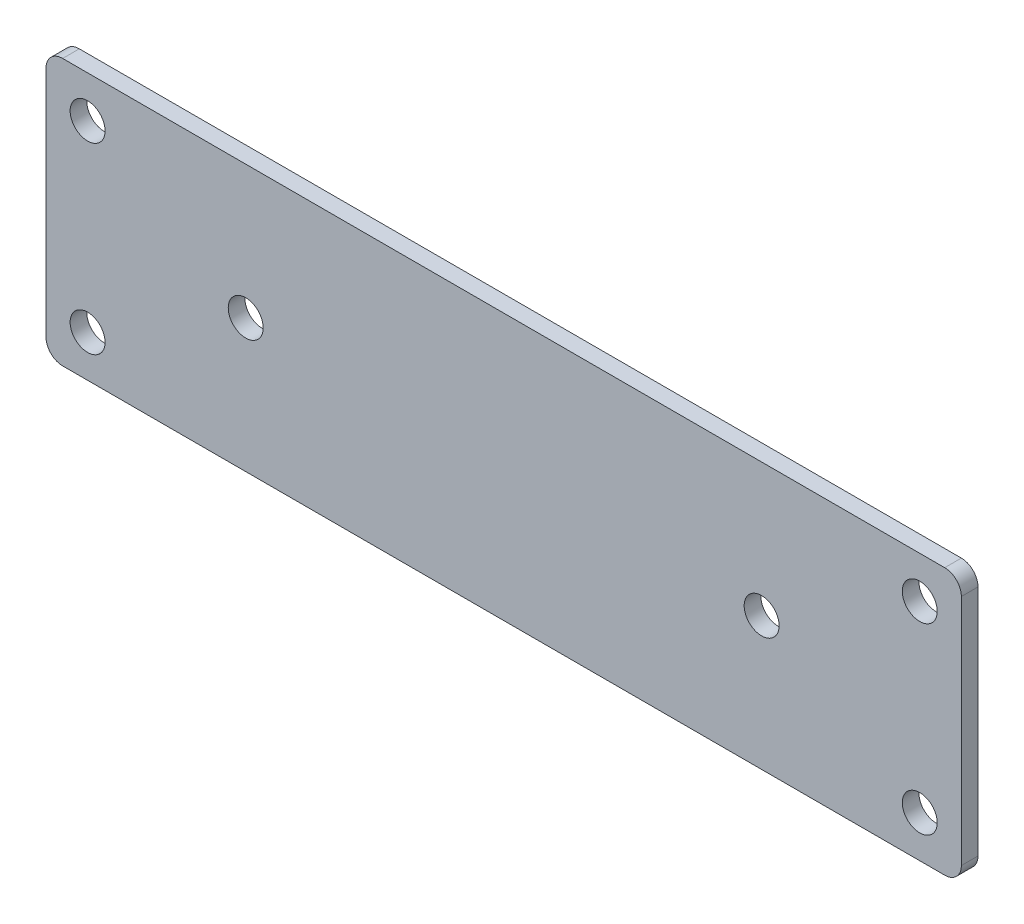
ISO-10303-21;
HEADER;
FILE_DESCRIPTION(('STEP AP214'),'2;1');
FILE_NAME('part.step','',(''),(''),'','','');
FILE_SCHEMA(('AUTOMOTIVE_DESIGN { 1 0 10303 214 1 1 1 1 }'));
ENDSEC;
DATA;
#1=APPLICATION_CONTEXT('core data for automotive mechanical design processes');
#2=APPLICATION_PROTOCOL_DEFINITION('international standard','automotive_design',2000,#1);
#3=PRODUCT_CONTEXT('',#1,'mechanical');
#4=PRODUCT('Part','Part','',(#3));
#5=PRODUCT_RELATED_PRODUCT_CATEGORY('part','',(#4));
#6=PRODUCT_DEFINITION_FORMATION('','',#4);
#7=PRODUCT_DEFINITION_CONTEXT('part definition',#1,'design');
#8=PRODUCT_DEFINITION('design','',#6,#7);
#9=PRODUCT_DEFINITION_SHAPE('','',#8);
#10=(LENGTH_UNIT() NAMED_UNIT(*) SI_UNIT(.MILLI.,.METRE.));
#11=(NAMED_UNIT(*) PLANE_ANGLE_UNIT() SI_UNIT($,.RADIAN.));
#12=(NAMED_UNIT(*) SI_UNIT($,.STERADIAN.) SOLID_ANGLE_UNIT());
#13=UNCERTAINTY_MEASURE_WITH_UNIT(LENGTH_MEASURE(1.E-05),#10,'distance_accuracy_value','');
#14=(GEOMETRIC_REPRESENTATION_CONTEXT(3) GLOBAL_UNCERTAINTY_ASSIGNED_CONTEXT((#13)) GLOBAL_UNIT_ASSIGNED_CONTEXT((#10,
#11,#12)) REPRESENTATION_CONTEXT('',''));
#15=CARTESIAN_POINT('',(0.,0.,0.));
#16=DIRECTION('',(0.,0.,1.));
#17=DIRECTION('',(1.,0.,0.));
#18=AXIS2_PLACEMENT_3D('',#15,#16,#17);
#19=CARTESIAN_POINT('',(0.,0.,2.));
#20=DIRECTION('',(0.,0.,1.));
#21=DIRECTION('',(1.,0.,0.));
#22=AXIS2_PLACEMENT_3D('',#19,#20,#21);
#23=PLANE('',#22);
#24=CARTESIAN_POINT('',(-50.,-11.,2.));
#25=DIRECTION('',(0.,0.,1.));
#26=DIRECTION('',(1.,0.,0.));
#27=AXIS2_PLACEMENT_3D('',#24,#25,#26);
#28=CIRCLE('',#27,2.10000000000002);
#29=CARTESIAN_POINT('',(-47.9,-11.,2.));
#30=VERTEX_POINT('',#29);
#31=EDGE_CURVE('E278',#30,#30,#28,.T.);
#32=ORIENTED_EDGE('',*,*,#31,.F.);
#33=EDGE_LOOP('',(#32));
#34=FACE_BOUND('',#33,.T.);
#35=CARTESIAN_POINT('',(50.,11.,2.));
#36=DIRECTION('',(0.,0.,1.));
#37=DIRECTION('',(1.,0.,0.));
#38=AXIS2_PLACEMENT_3D('',#35,#36,#37);
#39=CIRCLE('',#38,2.1);
#40=CARTESIAN_POINT('',(52.1,11.,2.));
#41=VERTEX_POINT('',#40);
#42=EDGE_CURVE('E170',#41,#41,#39,.T.);
#43=ORIENTED_EDGE('',*,*,#42,.F.);
#44=EDGE_LOOP('',(#43));
#45=FACE_BOUND('',#44,.T.);
#46=CARTESIAN_POINT('',(31.,0.,2.));
#47=DIRECTION('',(0.,0.,1.));
#48=DIRECTION('',(1.,0.,0.));
#49=AXIS2_PLACEMENT_3D('',#46,#47,#48);
#50=CIRCLE('',#49,2.1);
#51=CARTESIAN_POINT('',(33.1,0.,2.));
#52=VERTEX_POINT('',#51);
#53=EDGE_CURVE('E171',#52,#52,#50,.T.);
#54=ORIENTED_EDGE('',*,*,#53,.F.);
#55=EDGE_LOOP('',(#54));
#56=FACE_BOUND('',#55,.T.);
#57=DIRECTION('',(0.,-1.,0.));
#58=VECTOR('',#57,1.);
#59=CARTESIAN_POINT('',(-55.,16.,2.));
#60=LINE('',#59,#58);
#61=CARTESIAN_POINT('',(-55.,14.,2.));
#62=VERTEX_POINT('',#61);
#63=CARTESIAN_POINT('',(-55.,-14.,2.));
#64=VERTEX_POINT('',#63);
#65=EDGE_CURVE('E184',#62,#64,#60,.T.);
#66=ORIENTED_EDGE('',*,*,#65,.T.);
#67=CARTESIAN_POINT('',(-53.,-14.,2.));
#68=DIRECTION('',(0.,0.,1.));
#69=DIRECTION('',(1.,0.,0.));
#70=AXIS2_PLACEMENT_3D('',#67,#68,#69);
#71=CIRCLE('',#70,2.);
#72=CARTESIAN_POINT('',(-53.,-16.,2.));
#73=VERTEX_POINT('',#72);
#74=EDGE_CURVE('E195',#64,#73,#71,.T.);
#75=ORIENTED_EDGE('',*,*,#74,.T.);
#76=DIRECTION('',(1.,0.,0.));
#77=VECTOR('',#76,1.);
#78=CARTESIAN_POINT('',(-55.,-16.,2.));
#79=LINE('',#78,#77);
#80=CARTESIAN_POINT('',(53.,-16.,2.));
#81=VERTEX_POINT('',#80);
#82=EDGE_CURVE('E123',#73,#81,#79,.T.);
#83=ORIENTED_EDGE('',*,*,#82,.T.);
#84=CARTESIAN_POINT('',(53.,-14.,2.));
#85=DIRECTION('',(0.,0.,1.));
#86=DIRECTION('',(1.,0.,0.));
#87=AXIS2_PLACEMENT_3D('',#84,#85,#86);
#88=CIRCLE('',#87,2.);
#89=CARTESIAN_POINT('',(55.,-14.,2.));
#90=VERTEX_POINT('',#89);
#91=EDGE_CURVE('E193',#81,#90,#88,.T.);
#92=ORIENTED_EDGE('',*,*,#91,.T.);
#93=DIRECTION('',(0.,1.,0.));
#94=VECTOR('',#93,1.);
#95=CARTESIAN_POINT('',(55.,16.,2.));
#96=LINE('',#95,#94);
#97=CARTESIAN_POINT('',(55.,14.,2.));
#98=VERTEX_POINT('',#97);
#99=EDGE_CURVE('E130',#90,#98,#96,.T.);
#100=ORIENTED_EDGE('',*,*,#99,.T.);
#101=CARTESIAN_POINT('',(53.,14.,2.));
#102=DIRECTION('',(0.,0.,1.));
#103=DIRECTION('',(1.,0.,0.));
#104=AXIS2_PLACEMENT_3D('',#101,#102,#103);
#105=CIRCLE('',#104,2.);
#106=CARTESIAN_POINT('',(53.,16.,2.));
#107=VERTEX_POINT('',#106);
#108=EDGE_CURVE('E58',#98,#107,#105,.T.);
#109=ORIENTED_EDGE('',*,*,#108,.T.);
#110=DIRECTION('',(-1.,0.,0.));
#111=VECTOR('',#110,1.);
#112=CARTESIAN_POINT('',(-55.,16.,2.));
#113=LINE('',#112,#111);
#114=CARTESIAN_POINT('',(-53.,16.,2.));
#115=VERTEX_POINT('',#114);
#116=EDGE_CURVE('E133',#107,#115,#113,.T.);
#117=ORIENTED_EDGE('',*,*,#116,.T.);
#118=CARTESIAN_POINT('',(-53.,14.,2.));
#119=DIRECTION('',(0.,0.,1.));
#120=DIRECTION('',(1.,0.,0.));
#121=AXIS2_PLACEMENT_3D('',#118,#119,#120);
#122=CIRCLE('',#121,2.);
#123=EDGE_CURVE('E147',#115,#62,#122,.T.);
#124=ORIENTED_EDGE('',*,*,#123,.T.);
#125=EDGE_LOOP('',(#66,#75,#83,#92,#100,#109,#117,#124));
#126=FACE_BOUND('',#125,.T.);
#127=CARTESIAN_POINT('',(-31.,0.,2.));
#128=DIRECTION('',(0.,0.,1.));
#129=DIRECTION('',(-1.,0.,0.));
#130=AXIS2_PLACEMENT_3D('',#127,#128,#129);
#131=CIRCLE('',#130,2.1);
#132=CARTESIAN_POINT('',(-33.1,0.,2.));
#133=VERTEX_POINT('',#132);
#134=EDGE_CURVE('E159',#133,#133,#131,.T.);
#135=ORIENTED_EDGE('',*,*,#134,.F.);
#136=EDGE_LOOP('',(#135));
#137=FACE_BOUND('',#136,.T.);
#138=CARTESIAN_POINT('',(-50.,11.,2.));
#139=DIRECTION('',(0.,0.,1.));
#140=DIRECTION('',(-1.,0.,0.));
#141=AXIS2_PLACEMENT_3D('',#138,#139,#140);
#142=CIRCLE('',#141,2.10000000000001);
#143=CARTESIAN_POINT('',(-52.1,11.,2.));
#144=VERTEX_POINT('',#143);
#145=EDGE_CURVE('E284',#144,#144,#142,.T.);
#146=ORIENTED_EDGE('',*,*,#145,.F.);
#147=EDGE_LOOP('',(#146));
#148=FACE_BOUND('',#147,.T.);
#149=CARTESIAN_POINT('',(50.,-11.,2.));
#150=DIRECTION('',(0.,0.,1.));
#151=DIRECTION('',(-1.,0.,0.));
#152=AXIS2_PLACEMENT_3D('',#149,#150,#151);
#153=CIRCLE('',#152,2.1);
#154=CARTESIAN_POINT('',(47.9,-11.,2.));
#155=VERTEX_POINT('',#154);
#156=EDGE_CURVE('E269',#155,#155,#153,.T.);
#157=ORIENTED_EDGE('',*,*,#156,.F.);
#158=EDGE_LOOP('',(#157));
#159=FACE_BOUND('',#158,.T.);
#160=ADVANCED_FACE('F37',(#34,#45,#56,#126,#137,#148,#159),#23,.T.);
#161=CARTESIAN_POINT('',(0.,0.,0.));
#162=DIRECTION('',(0.,0.,1.));
#163=DIRECTION('',(1.,0.,0.));
#164=AXIS2_PLACEMENT_3D('',#161,#162,#163);
#165=PLANE('',#164);
#166=DIRECTION('',(1.,0.,0.));
#167=VECTOR('',#166,1.);
#168=CARTESIAN_POINT('',(-55.,-16.,0.));
#169=LINE('',#168,#167);
#170=CARTESIAN_POINT('',(-53.,-16.,0.));
#171=VERTEX_POINT('',#170);
#172=CARTESIAN_POINT('',(53.,-16.,0.));
#173=VERTEX_POINT('',#172);
#174=EDGE_CURVE('E120',#171,#173,#169,.T.);
#175=ORIENTED_EDGE('',*,*,#174,.F.);
#176=CARTESIAN_POINT('',(-53.,-14.,0.));
#177=DIRECTION('',(0.,0.,1.));
#178=DIRECTION('',(1.,0.,0.));
#179=AXIS2_PLACEMENT_3D('',#176,#177,#178);
#180=CIRCLE('',#179,2.);
#181=CARTESIAN_POINT('',(-55.,-14.,0.));
#182=VERTEX_POINT('',#181);
#183=EDGE_CURVE('E103',#171,#182,#180,.F.);
#184=ORIENTED_EDGE('',*,*,#183,.T.);
#185=DIRECTION('',(0.,-1.,0.));
#186=VECTOR('',#185,1.);
#187=CARTESIAN_POINT('',(-55.,16.,0.));
#188=LINE('',#187,#186);
#189=CARTESIAN_POINT('',(-55.,14.,0.));
#190=VERTEX_POINT('',#189);
#191=EDGE_CURVE('E131',#190,#182,#188,.T.);
#192=ORIENTED_EDGE('',*,*,#191,.F.);
#193=CARTESIAN_POINT('',(-53.,14.,0.));
#194=DIRECTION('',(0.,0.,1.));
#195=DIRECTION('',(1.,0.,0.));
#196=AXIS2_PLACEMENT_3D('',#193,#194,#195);
#197=CIRCLE('',#196,2.);
#198=CARTESIAN_POINT('',(-53.,16.,0.));
#199=VERTEX_POINT('',#198);
#200=EDGE_CURVE('E124',#190,#199,#197,.F.);
#201=ORIENTED_EDGE('',*,*,#200,.T.);
#202=DIRECTION('',(-1.,0.,0.));
#203=VECTOR('',#202,1.);
#204=CARTESIAN_POINT('',(-55.,16.,0.));
#205=LINE('',#204,#203);
#206=CARTESIAN_POINT('',(53.,16.,0.));
#207=VERTEX_POINT('',#206);
#208=EDGE_CURVE('E135',#207,#199,#205,.T.);
#209=ORIENTED_EDGE('',*,*,#208,.F.);
#210=CARTESIAN_POINT('',(53.,14.,0.));
#211=DIRECTION('',(0.,0.,1.));
#212=DIRECTION('',(1.,0.,0.));
#213=AXIS2_PLACEMENT_3D('',#210,#211,#212);
#214=CIRCLE('',#213,2.);
#215=CARTESIAN_POINT('',(55.,14.,0.));
#216=VERTEX_POINT('',#215);
#217=EDGE_CURVE('E141',#207,#216,#214,.F.);
#218=ORIENTED_EDGE('',*,*,#217,.T.);
#219=DIRECTION('',(0.,1.,0.));
#220=VECTOR('',#219,1.);
#221=CARTESIAN_POINT('',(55.,16.,0.));
#222=LINE('',#221,#220);
#223=CARTESIAN_POINT('',(55.,-14.,0.));
#224=VERTEX_POINT('',#223);
#225=EDGE_CURVE('E175',#224,#216,#222,.T.);
#226=ORIENTED_EDGE('',*,*,#225,.F.);
#227=CARTESIAN_POINT('',(53.,-14.,0.));
#228=DIRECTION('',(0.,0.,1.));
#229=DIRECTION('',(1.,0.,0.));
#230=AXIS2_PLACEMENT_3D('',#227,#228,#229);
#231=CIRCLE('',#230,2.);
#232=EDGE_CURVE('E114',#224,#173,#231,.F.);
#233=ORIENTED_EDGE('',*,*,#232,.T.);
#234=EDGE_LOOP('',(#175,#184,#192,#201,#209,#218,#226,#233));
#235=FACE_BOUND('',#234,.T.);
#236=CARTESIAN_POINT('',(31.,0.,0.));
#237=DIRECTION('',(0.,0.,1.));
#238=DIRECTION('',(1.,0.,0.));
#239=AXIS2_PLACEMENT_3D('',#236,#237,#238);
#240=CIRCLE('',#239,2.1);
#241=CARTESIAN_POINT('',(33.1,0.,0.));
#242=VERTEX_POINT('',#241);
#243=EDGE_CURVE('E164',#242,#242,#240,.T.);
#244=ORIENTED_EDGE('',*,*,#243,.T.);
#245=EDGE_LOOP('',(#244));
#246=FACE_BOUND('',#245,.T.);
#247=CARTESIAN_POINT('',(-31.,0.,0.));
#248=DIRECTION('',(0.,0.,1.));
#249=DIRECTION('',(-1.,0.,0.));
#250=AXIS2_PLACEMENT_3D('',#247,#248,#249);
#251=CIRCLE('',#250,2.1);
#252=CARTESIAN_POINT('',(-33.1,0.,0.));
#253=VERTEX_POINT('',#252);
#254=EDGE_CURVE('E165',#253,#253,#251,.T.);
#255=ORIENTED_EDGE('',*,*,#254,.T.);
#256=EDGE_LOOP('',(#255));
#257=FACE_BOUND('',#256,.T.);
#258=CARTESIAN_POINT('',(50.,11.,0.));
#259=DIRECTION('',(0.,0.,1.));
#260=DIRECTION('',(1.,0.,0.));
#261=AXIS2_PLACEMENT_3D('',#258,#259,#260);
#262=CIRCLE('',#261,2.1);
#263=CARTESIAN_POINT('',(52.1,11.,0.));
#264=VERTEX_POINT('',#263);
#265=EDGE_CURVE('E166',#264,#264,#262,.T.);
#266=ORIENTED_EDGE('',*,*,#265,.T.);
#267=EDGE_LOOP('',(#266));
#268=FACE_BOUND('',#267,.T.);
#269=CARTESIAN_POINT('',(-50.,11.,0.));
#270=DIRECTION('',(0.,0.,1.));
#271=DIRECTION('',(-1.,0.,0.));
#272=AXIS2_PLACEMENT_3D('',#269,#270,#271);
#273=CIRCLE('',#272,2.10000000000001);
#274=CARTESIAN_POINT('',(-52.1,11.,0.));
#275=VERTEX_POINT('',#274);
#276=EDGE_CURVE('E282',#275,#275,#273,.T.);
#277=ORIENTED_EDGE('',*,*,#276,.T.);
#278=EDGE_LOOP('',(#277));
#279=FACE_BOUND('',#278,.T.);
#280=CARTESIAN_POINT('',(-50.,-11.,0.));
#281=DIRECTION('',(0.,0.,1.));
#282=DIRECTION('',(1.,0.,0.));
#283=AXIS2_PLACEMENT_3D('',#280,#281,#282);
#284=CIRCLE('',#283,2.10000000000002);
#285=CARTESIAN_POINT('',(-47.9,-11.,0.));
#286=VERTEX_POINT('',#285);
#287=EDGE_CURVE('E275',#286,#286,#284,.T.);
#288=ORIENTED_EDGE('',*,*,#287,.T.);
#289=EDGE_LOOP('',(#288));
#290=FACE_BOUND('',#289,.T.);
#291=CARTESIAN_POINT('',(50.,-11.,0.));
#292=DIRECTION('',(0.,0.,1.));
#293=DIRECTION('',(-1.,0.,0.));
#294=AXIS2_PLACEMENT_3D('',#291,#292,#293);
#295=CIRCLE('',#294,2.1);
#296=CARTESIAN_POINT('',(47.9,-11.,0.));
#297=VERTEX_POINT('',#296);
#298=EDGE_CURVE('E272',#297,#297,#295,.T.);
#299=ORIENTED_EDGE('',*,*,#298,.T.);
#300=EDGE_LOOP('',(#299));
#301=FACE_BOUND('',#300,.T.);
#302=ADVANCED_FACE('F127',(#235,#246,#257,#268,#279,#290,#301),#165,.F.);
#303=CARTESIAN_POINT('',(55.,16.,2.));
#304=DIRECTION('',(-1.,0.,0.));
#305=DIRECTION('',(0.,-1.,0.));
#306=AXIS2_PLACEMENT_3D('',#303,#304,#305);
#307=PLANE('',#306);
#308=ORIENTED_EDGE('',*,*,#99,.F.);
#309=DIRECTION('',(0.,0.,-1.));
#310=VECTOR('',#309,1.);
#311=CARTESIAN_POINT('',(55.,-14.,2.));
#312=LINE('',#311,#310);
#313=EDGE_CURVE('E200',#90,#224,#312,.T.);
#314=ORIENTED_EDGE('',*,*,#313,.T.);
#315=ORIENTED_EDGE('',*,*,#225,.T.);
#316=DIRECTION('',(0.,0.,-1.));
#317=VECTOR('',#316,1.);
#318=CARTESIAN_POINT('',(55.,14.,2.));
#319=LINE('',#318,#317);
#320=EDGE_CURVE('E198',#216,#98,#319,.F.);
#321=ORIENTED_EDGE('',*,*,#320,.T.);
#322=EDGE_LOOP('',(#308,#314,#315,#321));
#323=FACE_BOUND('',#322,.T.);
#324=ADVANCED_FACE('F206',(#323),#307,.F.);
#325=CARTESIAN_POINT('',(-55.,16.,2.));
#326=DIRECTION('',(0.,-1.,0.));
#327=DIRECTION('',(0.,0.,-1.));
#328=AXIS2_PLACEMENT_3D('',#325,#326,#327);
#329=PLANE('',#328);
#330=ORIENTED_EDGE('',*,*,#116,.F.);
#331=DIRECTION('',(0.,0.,-1.));
#332=VECTOR('',#331,1.);
#333=CARTESIAN_POINT('',(53.,16.,2.));
#334=LINE('',#333,#332);
#335=EDGE_CURVE('E12',#107,#207,#334,.T.);
#336=ORIENTED_EDGE('',*,*,#335,.T.);
#337=ORIENTED_EDGE('',*,*,#208,.T.);
#338=DIRECTION('',(0.,0.,-1.));
#339=VECTOR('',#338,1.);
#340=CARTESIAN_POINT('',(-53.,16.,2.));
#341=LINE('',#340,#339);
#342=EDGE_CURVE('E45',#199,#115,#341,.F.);
#343=ORIENTED_EDGE('',*,*,#342,.T.);
#344=EDGE_LOOP('',(#330,#336,#337,#343));
#345=FACE_BOUND('',#344,.T.);
#346=ADVANCED_FACE('F211',(#345),#329,.F.);
#347=CARTESIAN_POINT('',(-55.,16.,2.));
#348=DIRECTION('',(1.,0.,0.));
#349=DIRECTION('',(0.,1.,0.));
#350=AXIS2_PLACEMENT_3D('',#347,#348,#349);
#351=PLANE('',#350);
#352=ORIENTED_EDGE('',*,*,#191,.T.);
#353=DIRECTION('',(0.,0.,-1.));
#354=VECTOR('',#353,1.);
#355=CARTESIAN_POINT('',(-55.,-14.,2.));
#356=LINE('',#355,#354);
#357=EDGE_CURVE('E108',#182,#64,#356,.F.);
#358=ORIENTED_EDGE('',*,*,#357,.T.);
#359=ORIENTED_EDGE('',*,*,#65,.F.);
#360=DIRECTION('',(0.,0.,-1.));
#361=VECTOR('',#360,1.);
#362=CARTESIAN_POINT('',(-55.,14.,2.));
#363=LINE('',#362,#361);
#364=EDGE_CURVE('E113',#62,#190,#363,.T.);
#365=ORIENTED_EDGE('',*,*,#364,.T.);
#366=EDGE_LOOP('',(#352,#358,#359,#365));
#367=FACE_BOUND('',#366,.T.);
#368=ADVANCED_FACE('F219',(#367),#351,.F.);
#369=CARTESIAN_POINT('',(-55.,-16.,2.));
#370=DIRECTION('',(0.,1.,0.));
#371=DIRECTION('',(0.,0.,1.));
#372=AXIS2_PLACEMENT_3D('',#369,#370,#371);
#373=PLANE('',#372);
#374=ORIENTED_EDGE('',*,*,#82,.F.);
#375=DIRECTION('',(0.,0.,-1.));
#376=VECTOR('',#375,1.);
#377=CARTESIAN_POINT('',(-53.,-16.,2.));
#378=LINE('',#377,#376);
#379=EDGE_CURVE('E107',#73,#171,#378,.T.);
#380=ORIENTED_EDGE('',*,*,#379,.T.);
#381=ORIENTED_EDGE('',*,*,#174,.T.);
#382=DIRECTION('',(0.,0.,-1.));
#383=VECTOR('',#382,1.);
#384=CARTESIAN_POINT('',(53.,-16.,2.));
#385=LINE('',#384,#383);
#386=EDGE_CURVE('E125',#173,#81,#385,.F.);
#387=ORIENTED_EDGE('',*,*,#386,.T.);
#388=EDGE_LOOP('',(#374,#380,#381,#387));
#389=FACE_BOUND('',#388,.T.);
#390=ADVANCED_FACE('F119',(#389),#373,.F.);
#391=CARTESIAN_POINT('',(31.,0.,2.));
#392=DIRECTION('',(0.,0.,-1.));
#393=DIRECTION('',(-1.,0.,0.));
#394=AXIS2_PLACEMENT_3D('',#391,#392,#393);
#395=CYLINDRICAL_SURFACE('',#394,2.1);
#396=ORIENTED_EDGE('',*,*,#53,.T.);
#397=EDGE_LOOP('',(#396));
#398=FACE_BOUND('',#397,.T.);
#399=ORIENTED_EDGE('',*,*,#243,.F.);
#400=EDGE_LOOP('',(#399));
#401=FACE_BOUND('',#400,.T.);
#402=ADVANCED_FACE('F226',(#398,#401),#395,.F.);
#403=CARTESIAN_POINT('',(-31.,0.,2.));
#404=DIRECTION('',(0.,0.,-1.));
#405=DIRECTION('',(-1.,0.,0.));
#406=AXIS2_PLACEMENT_3D('',#403,#404,#405);
#407=CYLINDRICAL_SURFACE('',#406,2.1);
#408=ORIENTED_EDGE('',*,*,#134,.T.);
#409=EDGE_LOOP('',(#408));
#410=FACE_BOUND('',#409,.T.);
#411=ORIENTED_EDGE('',*,*,#254,.F.);
#412=EDGE_LOOP('',(#411));
#413=FACE_BOUND('',#412,.T.);
#414=ADVANCED_FACE('F241',(#410,#413),#407,.F.);
#415=CARTESIAN_POINT('',(50.,11.,2.));
#416=DIRECTION('',(0.,0.,-1.));
#417=DIRECTION('',(-1.,0.,0.));
#418=AXIS2_PLACEMENT_3D('',#415,#416,#417);
#419=CYLINDRICAL_SURFACE('',#418,2.1);
#420=ORIENTED_EDGE('',*,*,#42,.T.);
#421=EDGE_LOOP('',(#420));
#422=FACE_BOUND('',#421,.T.);
#423=ORIENTED_EDGE('',*,*,#265,.F.);
#424=EDGE_LOOP('',(#423));
#425=FACE_BOUND('',#424,.T.);
#426=ADVANCED_FACE('F245',(#422,#425),#419,.F.);
#427=CARTESIAN_POINT('',(-50.,11.,2.));
#428=DIRECTION('',(0.,0.,-1.));
#429=DIRECTION('',(-1.,0.,0.));
#430=AXIS2_PLACEMENT_3D('',#427,#428,#429);
#431=CYLINDRICAL_SURFACE('',#430,2.10000000000001);
#432=ORIENTED_EDGE('',*,*,#145,.T.);
#433=EDGE_LOOP('',(#432));
#434=FACE_BOUND('',#433,.T.);
#435=ORIENTED_EDGE('',*,*,#276,.F.);
#436=EDGE_LOOP('',(#435));
#437=FACE_BOUND('',#436,.T.);
#438=ADVANCED_FACE('F249',(#434,#437),#431,.F.);
#439=CARTESIAN_POINT('',(-50.,-11.,2.));
#440=DIRECTION('',(0.,0.,-1.));
#441=DIRECTION('',(-1.,0.,0.));
#442=AXIS2_PLACEMENT_3D('',#439,#440,#441);
#443=CYLINDRICAL_SURFACE('',#442,2.10000000000002);
#444=ORIENTED_EDGE('',*,*,#31,.T.);
#445=EDGE_LOOP('',(#444));
#446=FACE_BOUND('',#445,.T.);
#447=ORIENTED_EDGE('',*,*,#287,.F.);
#448=EDGE_LOOP('',(#447));
#449=FACE_BOUND('',#448,.T.);
#450=ADVANCED_FACE('F253',(#446,#449),#443,.F.);
#451=CARTESIAN_POINT('',(50.,-11.,2.));
#452=DIRECTION('',(0.,0.,-1.));
#453=DIRECTION('',(-1.,0.,0.));
#454=AXIS2_PLACEMENT_3D('',#451,#452,#453);
#455=CYLINDRICAL_SURFACE('',#454,2.1);
#456=ORIENTED_EDGE('',*,*,#156,.T.);
#457=EDGE_LOOP('',(#456));
#458=FACE_BOUND('',#457,.T.);
#459=ORIENTED_EDGE('',*,*,#298,.F.);
#460=EDGE_LOOP('',(#459));
#461=FACE_BOUND('',#460,.T.);
#462=ADVANCED_FACE('F257',(#458,#461),#455,.F.);
#463=CARTESIAN_POINT('',(-53.,-14.,2.));
#464=DIRECTION('',(0.,0.,-1.));
#465=DIRECTION('',(-1.,0.,0.));
#466=AXIS2_PLACEMENT_3D('',#463,#464,#465);
#467=CYLINDRICAL_SURFACE('',#466,2.);
#468=ORIENTED_EDGE('',*,*,#74,.F.);
#469=ORIENTED_EDGE('',*,*,#357,.F.);
#470=ORIENTED_EDGE('',*,*,#183,.F.);
#471=ORIENTED_EDGE('',*,*,#379,.F.);
#472=EDGE_LOOP('',(#468,#469,#470,#471));
#473=FACE_BOUND('',#472,.T.);
#474=ADVANCED_FACE('F106',(#473),#467,.T.);
#475=CARTESIAN_POINT('',(53.,-14.,2.));
#476=DIRECTION('',(0.,0.,-1.));
#477=DIRECTION('',(-1.,0.,0.));
#478=AXIS2_PLACEMENT_3D('',#475,#476,#477);
#479=CYLINDRICAL_SURFACE('',#478,2.);
#480=ORIENTED_EDGE('',*,*,#91,.F.);
#481=ORIENTED_EDGE('',*,*,#386,.F.);
#482=ORIENTED_EDGE('',*,*,#232,.F.);
#483=ORIENTED_EDGE('',*,*,#313,.F.);
#484=EDGE_LOOP('',(#480,#481,#482,#483));
#485=FACE_BOUND('',#484,.T.);
#486=ADVANCED_FACE('F264',(#485),#479,.T.);
#487=CARTESIAN_POINT('',(53.,14.,2.));
#488=DIRECTION('',(0.,0.,-1.));
#489=DIRECTION('',(-1.,0.,0.));
#490=AXIS2_PLACEMENT_3D('',#487,#488,#489);
#491=CYLINDRICAL_SURFACE('',#490,2.);
#492=ORIENTED_EDGE('',*,*,#108,.F.);
#493=ORIENTED_EDGE('',*,*,#320,.F.);
#494=ORIENTED_EDGE('',*,*,#217,.F.);
#495=ORIENTED_EDGE('',*,*,#335,.F.);
#496=EDGE_LOOP('',(#492,#493,#494,#495));
#497=FACE_BOUND('',#496,.T.);
#498=ADVANCED_FACE('F316',(#497),#491,.T.);
#499=CARTESIAN_POINT('',(-53.,14.,2.));
#500=DIRECTION('',(0.,0.,-1.));
#501=DIRECTION('',(-1.,0.,0.));
#502=AXIS2_PLACEMENT_3D('',#499,#500,#501);
#503=CYLINDRICAL_SURFACE('',#502,2.);
#504=ORIENTED_EDGE('',*,*,#123,.F.);
#505=ORIENTED_EDGE('',*,*,#342,.F.);
#506=ORIENTED_EDGE('',*,*,#200,.F.);
#507=ORIENTED_EDGE('',*,*,#364,.F.);
#508=EDGE_LOOP('',(#504,#505,#506,#507));
#509=FACE_BOUND('',#508,.T.);
#510=ADVANCED_FACE('F39',(#509),#503,.T.);
#511=CLOSED_SHELL('',(#160,#302,#324,#346,#368,#390,#402,#414,#426,#438,#450,#462,#474,#486,
#498,#510));
#512=MANIFOLD_SOLID_BREP('B2',#511);
#513=ADVANCED_BREP_SHAPE_REPRESENTATION('',(#18,#512),#14);
#514=SHAPE_DEFINITION_REPRESENTATION(#9,#513);
ENDSEC;
END-ISO-10303-21;
